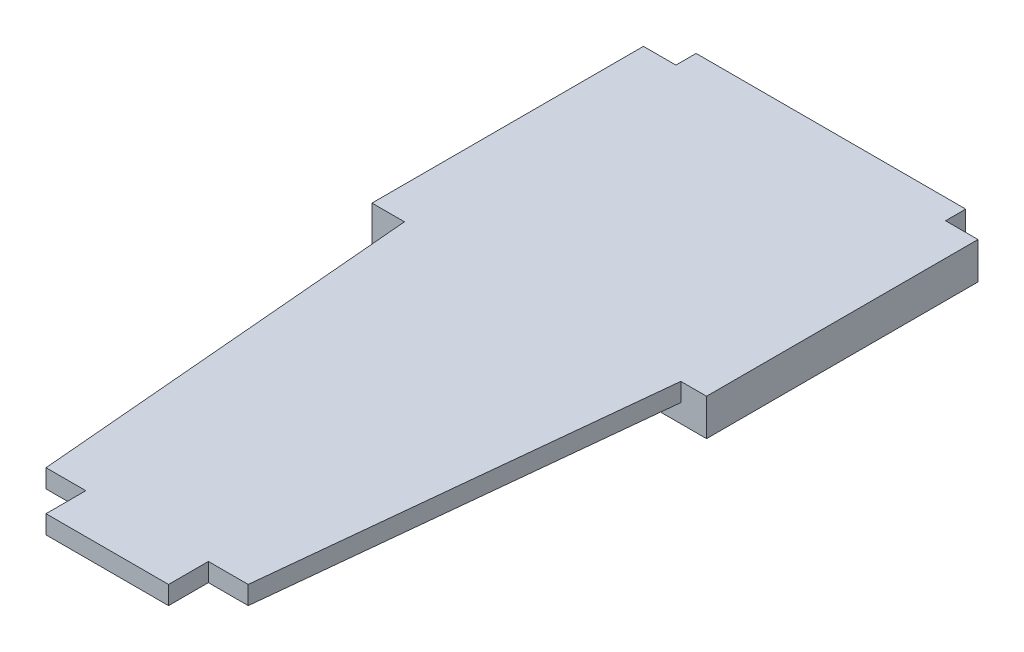
ISO-10303-21;
HEADER;
FILE_DESCRIPTION(('STEP AP214'),'2;1');
FILE_NAME('part.step','',(''),(''),'','','');
FILE_SCHEMA(('AUTOMOTIVE_DESIGN { 1 0 10303 214 1 1 1 1 }'));
ENDSEC;
DATA;
#1=APPLICATION_CONTEXT('core data for automotive mechanical design processes');
#2=APPLICATION_PROTOCOL_DEFINITION('international standard','automotive_design',2000,#1);
#3=PRODUCT_CONTEXT('',#1,'mechanical');
#4=PRODUCT('Part','Part','',(#3));
#5=PRODUCT_RELATED_PRODUCT_CATEGORY('part','',(#4));
#6=PRODUCT_DEFINITION_FORMATION('','',#4);
#7=PRODUCT_DEFINITION_CONTEXT('part definition',#1,'design');
#8=PRODUCT_DEFINITION('design','',#6,#7);
#9=PRODUCT_DEFINITION_SHAPE('','',#8);
#10=(LENGTH_UNIT() NAMED_UNIT(*) SI_UNIT(.MILLI.,.METRE.));
#11=(NAMED_UNIT(*) PLANE_ANGLE_UNIT() SI_UNIT($,.RADIAN.));
#12=(NAMED_UNIT(*) SI_UNIT($,.STERADIAN.) SOLID_ANGLE_UNIT());
#13=UNCERTAINTY_MEASURE_WITH_UNIT(LENGTH_MEASURE(1.E-05),#10,'distance_accuracy_value','');
#14=(GEOMETRIC_REPRESENTATION_CONTEXT(3) GLOBAL_UNCERTAINTY_ASSIGNED_CONTEXT((#13)) GLOBAL_UNIT_ASSIGNED_CONTEXT((#10,
#11,#12)) REPRESENTATION_CONTEXT('',''));
#15=CARTESIAN_POINT('',(0.,0.,0.));
#16=DIRECTION('',(0.,0.,1.));
#17=DIRECTION('',(1.,0.,0.));
#18=AXIS2_PLACEMENT_3D('',#15,#16,#17);
#19=CARTESIAN_POINT('',(22.,3.,0.));
#20=DIRECTION('',(1.,0.,0.));
#21=DIRECTION('',(0.,0.,-1.));
#22=AXIS2_PLACEMENT_3D('',#19,#20,#21);
#23=PLANE('',#22);
#24=DIRECTION('',(0.,-1.,0.));
#25=VECTOR('',#24,1.);
#26=CARTESIAN_POINT('',(22.,3.,-108.3));
#27=LINE('',#26,#25);
#28=CARTESIAN_POINT('',(22.,3.,-108.3));
#29=VERTEX_POINT('',#28);
#30=CARTESIAN_POINT('',(22.,-3.,-108.3));
#31=VERTEX_POINT('',#30);
#32=EDGE_CURVE('E60',#29,#31,#27,.T.);
#33=ORIENTED_EDGE('',*,*,#32,.T.);
#34=DIRECTION('',(0.,0.,1.));
#35=VECTOR('',#34,1.);
#36=CARTESIAN_POINT('',(22.,-3.,0.));
#37=LINE('',#36,#35);
#38=CARTESIAN_POINT('',(22.,-3.,-111.6));
#39=VERTEX_POINT('',#38);
#40=EDGE_CURVE('E243',#39,#31,#37,.T.);
#41=ORIENTED_EDGE('',*,*,#40,.F.);
#42=DIRECTION('',(0.,-1.,0.));
#43=VECTOR('',#42,1.);
#44=CARTESIAN_POINT('',(22.,3.,-111.6));
#45=LINE('',#44,#43);
#46=CARTESIAN_POINT('',(22.,3.,-111.6));
#47=VERTEX_POINT('',#46);
#48=EDGE_CURVE('E46',#47,#39,#45,.T.);
#49=ORIENTED_EDGE('',*,*,#48,.F.);
#50=DIRECTION('',(0.,0.,1.));
#51=VECTOR('',#50,1.);
#52=CARTESIAN_POINT('',(22.,3.,0.));
#53=LINE('',#52,#51);
#54=EDGE_CURVE('E193',#47,#29,#53,.T.);
#55=ORIENTED_EDGE('',*,*,#54,.T.);
#56=EDGE_LOOP('',(#33,#41,#49,#55));
#57=FACE_BOUND('',#56,.T.);
#58=ADVANCED_FACE('F43',(#57),#23,.T.);
#59=CARTESIAN_POINT('',(0.,3.,-111.6));
#60=DIRECTION('',(0.,0.,-1.));
#61=DIRECTION('',(-1.,0.,0.));
#62=AXIS2_PLACEMENT_3D('',#59,#60,#61);
#63=PLANE('',#62);
#64=ORIENTED_EDGE('',*,*,#48,.T.);
#65=DIRECTION('',(1.,0.,0.));
#66=VECTOR('',#65,1.);
#67=CARTESIAN_POINT('',(0.,-3.,-111.6));
#68=LINE('',#67,#66);
#69=CARTESIAN_POINT('',(-22.,-3.,-111.6));
#70=VERTEX_POINT('',#69);
#71=EDGE_CURVE('E234',#70,#39,#68,.T.);
#72=ORIENTED_EDGE('',*,*,#71,.F.);
#73=DIRECTION('',(0.,-1.,0.));
#74=VECTOR('',#73,1.);
#75=CARTESIAN_POINT('',(-22.,3.,-111.6));
#76=LINE('',#75,#74);
#77=CARTESIAN_POINT('',(-22.,3.,-111.6));
#78=VERTEX_POINT('',#77);
#79=EDGE_CURVE('E221',#78,#70,#76,.T.);
#80=ORIENTED_EDGE('',*,*,#79,.F.);
#81=DIRECTION('',(1.,0.,0.));
#82=VECTOR('',#81,1.);
#83=CARTESIAN_POINT('',(0.,3.,-111.6));
#84=LINE('',#83,#82);
#85=EDGE_CURVE('E236',#78,#47,#84,.T.);
#86=ORIENTED_EDGE('',*,*,#85,.T.);
#87=EDGE_LOOP('',(#64,#72,#80,#86));
#88=FACE_BOUND('',#87,.T.);
#89=ADVANCED_FACE('F233',(#88),#63,.T.);
#90=CARTESIAN_POINT('',(-22.,3.,0.));
#91=DIRECTION('',(1.,0.,0.));
#92=DIRECTION('',(0.,0.,-1.));
#93=AXIS2_PLACEMENT_3D('',#90,#91,#92);
#94=PLANE('',#93);
#95=ORIENTED_EDGE('',*,*,#79,.T.);
#96=DIRECTION('',(0.,0.,-1.));
#97=VECTOR('',#96,1.);
#98=CARTESIAN_POINT('',(-22.,-3.,0.));
#99=LINE('',#98,#97);
#100=CARTESIAN_POINT('',(-22.,-3.,-108.3));
#101=VERTEX_POINT('',#100);
#102=EDGE_CURVE('E245',#101,#70,#99,.T.);
#103=ORIENTED_EDGE('',*,*,#102,.F.);
#104=DIRECTION('',(0.,-1.,0.));
#105=VECTOR('',#104,1.);
#106=CARTESIAN_POINT('',(-22.,3.,-108.3));
#107=LINE('',#106,#105);
#108=CARTESIAN_POINT('',(-22.,3.,-108.3));
#109=VERTEX_POINT('',#108);
#110=EDGE_CURVE('E219',#109,#101,#107,.T.);
#111=ORIENTED_EDGE('',*,*,#110,.F.);
#112=DIRECTION('',(0.,0.,1.));
#113=VECTOR('',#112,1.);
#114=CARTESIAN_POINT('',(-22.,3.,0.));
#115=LINE('',#114,#113);
#116=EDGE_CURVE('E255',#78,#109,#115,.T.);
#117=ORIENTED_EDGE('',*,*,#116,.F.);
#118=EDGE_LOOP('',(#95,#103,#111,#117));
#119=FACE_BOUND('',#118,.T.);
#120=ADVANCED_FACE('F307',(#119),#94,.F.);
#121=CARTESIAN_POINT('',(0.,3.,-108.3));
#122=DIRECTION('',(0.,0.,-1.));
#123=DIRECTION('',(-1.,0.,0.));
#124=AXIS2_PLACEMENT_3D('',#121,#122,#123);
#125=PLANE('',#124);
#126=ORIENTED_EDGE('',*,*,#110,.T.);
#127=DIRECTION('',(1.,0.,0.));
#128=VECTOR('',#127,1.);
#129=CARTESIAN_POINT('',(0.,-3.,-108.3));
#130=LINE('',#129,#128);
#131=CARTESIAN_POINT('',(-27.3,-3.,-108.3));
#132=VERTEX_POINT('',#131);
#133=EDGE_CURVE('E301',#132,#101,#130,.T.);
#134=ORIENTED_EDGE('',*,*,#133,.F.);
#135=DIRECTION('',(0.,-1.,0.));
#136=VECTOR('',#135,1.);
#137=CARTESIAN_POINT('',(-27.3,3.,-108.3));
#138=LINE('',#137,#136);
#139=CARTESIAN_POINT('',(-27.3,3.,-108.3));
#140=VERTEX_POINT('',#139);
#141=EDGE_CURVE('E216',#140,#132,#138,.T.);
#142=ORIENTED_EDGE('',*,*,#141,.F.);
#143=DIRECTION('',(1.,0.,0.));
#144=VECTOR('',#143,1.);
#145=CARTESIAN_POINT('',(0.,3.,-108.3));
#146=LINE('',#145,#144);
#147=EDGE_CURVE('E174',#140,#109,#146,.T.);
#148=ORIENTED_EDGE('',*,*,#147,.T.);
#149=EDGE_LOOP('',(#126,#134,#142,#148));
#150=FACE_BOUND('',#149,.T.);
#151=ADVANCED_FACE('F309',(#150),#125,.T.);
#152=CARTESIAN_POINT('',(-27.3,3.,0.));
#153=DIRECTION('',(-1.,0.,0.));
#154=DIRECTION('',(0.,0.,1.));
#155=AXIS2_PLACEMENT_3D('',#152,#153,#154);
#156=PLANE('',#155);
#157=ORIENTED_EDGE('',*,*,#141,.T.);
#158=DIRECTION('',(0.,0.,-1.));
#159=VECTOR('',#158,1.);
#160=CARTESIAN_POINT('',(-27.3,-3.,0.));
#161=LINE('',#160,#159);
#162=CARTESIAN_POINT('',(-27.3,-3.,-64.));
#163=VERTEX_POINT('',#162);
#164=EDGE_CURVE('E298',#163,#132,#161,.T.);
#165=ORIENTED_EDGE('',*,*,#164,.F.);
#166=DIRECTION('',(0.,-1.,0.));
#167=VECTOR('',#166,1.);
#168=CARTESIAN_POINT('',(-27.3,3.,-64.));
#169=LINE('',#168,#167);
#170=CARTESIAN_POINT('',(-27.3,3.,-64.));
#171=VERTEX_POINT('',#170);
#172=EDGE_CURVE('E214',#171,#163,#169,.T.);
#173=ORIENTED_EDGE('',*,*,#172,.F.);
#174=DIRECTION('',(0.,0.,-1.));
#175=VECTOR('',#174,1.);
#176=CARTESIAN_POINT('',(-27.3,3.,0.));
#177=LINE('',#176,#175);
#178=EDGE_CURVE('E258',#171,#140,#177,.T.);
#179=ORIENTED_EDGE('',*,*,#178,.T.);
#180=EDGE_LOOP('',(#157,#165,#173,#179));
#181=FACE_BOUND('',#180,.T.);
#182=ADVANCED_FACE('F299',(#181),#156,.T.);
#183=CARTESIAN_POINT('',(-16.3790366555589,3.,1.40757346258709));
#184=DIRECTION('',(-0.996327701218676,0.,0.08562191182348));
#185=DIRECTION('',(0.08562191182348,0.,0.996327701218677));
#186=AXIS2_PLACEMENT_3D('',#183,#184,#185);
#187=PLANE('',#186);
#188=DIRECTION('',(-0.08562191182348,0.,-0.996327701218677));
#189=VECTOR('',#188,1.);
#190=CARTESIAN_POINT('',(-16.3790366555589,0.,1.40757346258709));
#191=LINE('',#190,#189);
#192=CARTESIAN_POINT('',(-16.5,0.,0.));
#193=VERTEX_POINT('',#192);
#194=CARTESIAN_POINT('',(-22.,0.,-64.));
#195=VERTEX_POINT('',#194);
#196=EDGE_CURVE('E178',#193,#195,#191,.T.);
#197=ORIENTED_EDGE('',*,*,#196,.F.);
#198=DIRECTION('',(0.,-1.,0.));
#199=VECTOR('',#198,1.);
#200=CARTESIAN_POINT('',(-16.5,3.,0.));
#201=LINE('',#200,#199);
#202=CARTESIAN_POINT('',(-16.5,3.,0.));
#203=VERTEX_POINT('',#202);
#204=EDGE_CURVE('E209',#203,#193,#201,.T.);
#205=ORIENTED_EDGE('',*,*,#204,.F.);
#206=DIRECTION('',(-0.08562191182348,0.,-0.996327701218677));
#207=VECTOR('',#206,1.);
#208=CARTESIAN_POINT('',(-16.3790366555589,3.,1.40757346258709));
#209=LINE('',#208,#207);
#210=CARTESIAN_POINT('',(-22.,3.,-64.));
#211=VERTEX_POINT('',#210);
#212=EDGE_CURVE('E261',#203,#211,#209,.T.);
#213=ORIENTED_EDGE('',*,*,#212,.T.);
#214=DIRECTION('',(0.,-1.,0.));
#215=VECTOR('',#214,1.);
#216=CARTESIAN_POINT('',(-22.,3.,-64.));
#217=LINE('',#216,#215);
#218=EDGE_CURVE('E211',#211,#195,#217,.T.);
#219=ORIENTED_EDGE('',*,*,#218,.T.);
#220=EDGE_LOOP('',(#197,#205,#213,#219));
#221=FACE_BOUND('',#220,.T.);
#222=ADVANCED_FACE('F334',(#221),#187,.T.);
#223=CARTESIAN_POINT('',(0.,3.,0.));
#224=DIRECTION('',(0.,0.,-1.));
#225=DIRECTION('',(-1.,0.,0.));
#226=AXIS2_PLACEMENT_3D('',#223,#224,#225);
#227=PLANE('',#226);
#228=DIRECTION('',(1.,0.,0.));
#229=VECTOR('',#228,1.);
#230=CARTESIAN_POINT('',(0.,0.,0.));
#231=LINE('',#230,#229);
#232=CARTESIAN_POINT('',(-10.,0.,0.));
#233=VERTEX_POINT('',#232);
#234=EDGE_CURVE('E181',#193,#233,#231,.T.);
#235=ORIENTED_EDGE('',*,*,#234,.T.);
#236=DIRECTION('',(0.,-1.,0.));
#237=VECTOR('',#236,1.);
#238=CARTESIAN_POINT('',(-10.,3.,0.));
#239=LINE('',#238,#237);
#240=CARTESIAN_POINT('',(-10.,3.,0.));
#241=VERTEX_POINT('',#240);
#242=EDGE_CURVE('E206',#241,#233,#239,.T.);
#243=ORIENTED_EDGE('',*,*,#242,.F.);
#244=DIRECTION('',(1.,0.,0.));
#245=VECTOR('',#244,1.);
#246=CARTESIAN_POINT('',(0.,3.,0.));
#247=LINE('',#246,#245);
#248=EDGE_CURVE('E264',#203,#241,#247,.T.);
#249=ORIENTED_EDGE('',*,*,#248,.F.);
#250=ORIENTED_EDGE('',*,*,#204,.T.);
#251=EDGE_LOOP('',(#235,#243,#249,#250));
#252=FACE_BOUND('',#251,.T.);
#253=ADVANCED_FACE('F337',(#252),#227,.F.);
#254=CARTESIAN_POINT('',(-10.,3.,0.));
#255=DIRECTION('',(1.,0.,0.));
#256=DIRECTION('',(0.,0.,-1.));
#257=AXIS2_PLACEMENT_3D('',#254,#255,#256);
#258=PLANE('',#257);
#259=DIRECTION('',(0.,0.,1.));
#260=VECTOR('',#259,1.);
#261=CARTESIAN_POINT('',(-10.,0.,0.));
#262=LINE('',#261,#260);
#263=CARTESIAN_POINT('',(-10.,0.,6.5));
#264=VERTEX_POINT('',#263);
#265=EDGE_CURVE('E184',#233,#264,#262,.T.);
#266=ORIENTED_EDGE('',*,*,#265,.T.);
#267=DIRECTION('',(0.,-1.,0.));
#268=VECTOR('',#267,1.);
#269=CARTESIAN_POINT('',(-10.,3.,6.5));
#270=LINE('',#269,#268);
#271=CARTESIAN_POINT('',(-10.,3.,6.5));
#272=VERTEX_POINT('',#271);
#273=EDGE_CURVE('E203',#272,#264,#270,.T.);
#274=ORIENTED_EDGE('',*,*,#273,.F.);
#275=DIRECTION('',(0.,0.,1.));
#276=VECTOR('',#275,1.);
#277=CARTESIAN_POINT('',(-10.,3.,0.));
#278=LINE('',#277,#276);
#279=EDGE_CURVE('E266',#241,#272,#278,.T.);
#280=ORIENTED_EDGE('',*,*,#279,.F.);
#281=ORIENTED_EDGE('',*,*,#242,.T.);
#282=EDGE_LOOP('',(#266,#274,#280,#281));
#283=FACE_BOUND('',#282,.T.);
#284=ADVANCED_FACE('F341',(#283),#258,.F.);
#285=CARTESIAN_POINT('',(0.,3.,6.5));
#286=DIRECTION('',(0.,0.,-1.));
#287=DIRECTION('',(-1.,0.,0.));
#288=AXIS2_PLACEMENT_3D('',#285,#286,#287);
#289=PLANE('',#288);
#290=DIRECTION('',(1.,0.,0.));
#291=VECTOR('',#290,1.);
#292=CARTESIAN_POINT('',(0.,0.,6.5));
#293=LINE('',#292,#291);
#294=CARTESIAN_POINT('',(10.,0.,6.5));
#295=VERTEX_POINT('',#294);
#296=EDGE_CURVE('E186',#264,#295,#293,.T.);
#297=ORIENTED_EDGE('',*,*,#296,.T.);
#298=DIRECTION('',(0.,-1.,0.));
#299=VECTOR('',#298,1.);
#300=CARTESIAN_POINT('',(10.,3.,6.5));
#301=LINE('',#300,#299);
#302=CARTESIAN_POINT('',(10.,3.,6.5));
#303=VERTEX_POINT('',#302);
#304=EDGE_CURVE('E201',#303,#295,#301,.T.);
#305=ORIENTED_EDGE('',*,*,#304,.F.);
#306=DIRECTION('',(1.,0.,0.));
#307=VECTOR('',#306,1.);
#308=CARTESIAN_POINT('',(0.,3.,6.5));
#309=LINE('',#308,#307);
#310=EDGE_CURVE('E268',#272,#303,#309,.T.);
#311=ORIENTED_EDGE('',*,*,#310,.F.);
#312=ORIENTED_EDGE('',*,*,#273,.T.);
#313=EDGE_LOOP('',(#297,#305,#311,#312));
#314=FACE_BOUND('',#313,.T.);
#315=ADVANCED_FACE('F345',(#314),#289,.F.);
#316=CARTESIAN_POINT('',(10.,3.,0.));
#317=DIRECTION('',(-1.,0.,0.));
#318=DIRECTION('',(0.,0.,1.));
#319=AXIS2_PLACEMENT_3D('',#316,#317,#318);
#320=PLANE('',#319);
#321=DIRECTION('',(0.,0.,-1.));
#322=VECTOR('',#321,1.);
#323=CARTESIAN_POINT('',(10.,0.,0.));
#324=LINE('',#323,#322);
#325=CARTESIAN_POINT('',(10.,0.,0.));
#326=VERTEX_POINT('',#325);
#327=EDGE_CURVE('E85',#295,#326,#324,.T.);
#328=ORIENTED_EDGE('',*,*,#327,.T.);
#329=DIRECTION('',(0.,-1.,0.));
#330=VECTOR('',#329,1.);
#331=CARTESIAN_POINT('',(10.,3.,0.));
#332=LINE('',#331,#330);
#333=CARTESIAN_POINT('',(10.,3.,0.));
#334=VERTEX_POINT('',#333);
#335=EDGE_CURVE('E199',#334,#326,#332,.T.);
#336=ORIENTED_EDGE('',*,*,#335,.F.);
#337=DIRECTION('',(0.,0.,-1.));
#338=VECTOR('',#337,1.);
#339=CARTESIAN_POINT('',(10.,3.,0.));
#340=LINE('',#339,#338);
#341=EDGE_CURVE('E270',#303,#334,#340,.T.);
#342=ORIENTED_EDGE('',*,*,#341,.F.);
#343=ORIENTED_EDGE('',*,*,#304,.T.);
#344=EDGE_LOOP('',(#328,#336,#342,#343));
#345=FACE_BOUND('',#344,.T.);
#346=ADVANCED_FACE('F349',(#345),#320,.F.);
#347=CARTESIAN_POINT('',(0.,3.,0.));
#348=DIRECTION('',(0.,0.,-1.));
#349=DIRECTION('',(-1.,0.,0.));
#350=AXIS2_PLACEMENT_3D('',#347,#348,#349);
#351=PLANE('',#350);
#352=DIRECTION('',(1.,0.,0.));
#353=VECTOR('',#352,1.);
#354=CARTESIAN_POINT('',(0.,0.,0.));
#355=LINE('',#354,#353);
#356=CARTESIAN_POINT('',(16.5,0.,0.));
#357=VERTEX_POINT('',#356);
#358=EDGE_CURVE('E92',#326,#357,#355,.T.);
#359=ORIENTED_EDGE('',*,*,#358,.T.);
#360=DIRECTION('',(0.,-1.,0.));
#361=VECTOR('',#360,1.);
#362=CARTESIAN_POINT('',(16.5,3.,0.));
#363=LINE('',#362,#361);
#364=CARTESIAN_POINT('',(16.5,3.,0.));
#365=VERTEX_POINT('',#364);
#366=EDGE_CURVE('E197',#365,#357,#363,.T.);
#367=ORIENTED_EDGE('',*,*,#366,.F.);
#368=DIRECTION('',(1.,0.,0.));
#369=VECTOR('',#368,1.);
#370=CARTESIAN_POINT('',(0.,3.,0.));
#371=LINE('',#370,#369);
#372=EDGE_CURVE('E271',#334,#365,#371,.T.);
#373=ORIENTED_EDGE('',*,*,#372,.F.);
#374=ORIENTED_EDGE('',*,*,#335,.T.);
#375=EDGE_LOOP('',(#359,#367,#373,#374));
#376=FACE_BOUND('',#375,.T.);
#377=ADVANCED_FACE('F274',(#376),#351,.F.);
#378=CARTESIAN_POINT('',(16.3263728512209,3.,1.68365720028216));
#379=DIRECTION('',(-0.994724656625258,0.,-0.10258098021448));
#380=DIRECTION('',(-0.10258098021448,0.,0.994724656625258));
#381=AXIS2_PLACEMENT_3D('',#378,#379,#380);
#382=PLANE('',#381);
#383=DIRECTION('',(0.10258098021448,0.,-0.994724656625258));
#384=VECTOR('',#383,1.);
#385=CARTESIAN_POINT('',(16.3263728512209,0.,1.68365720028216));
#386=LINE('',#385,#384);
#387=CARTESIAN_POINT('',(23.1,0.,-64.));
#388=VERTEX_POINT('',#387);
#389=EDGE_CURVE('E190',#357,#388,#386,.T.);
#390=ORIENTED_EDGE('',*,*,#389,.T.);
#391=DIRECTION('',(0.,-1.,0.));
#392=VECTOR('',#391,1.);
#393=CARTESIAN_POINT('',(23.1,3.,-64.));
#394=LINE('',#393,#392);
#395=CARTESIAN_POINT('',(23.1,3.,-64.));
#396=VERTEX_POINT('',#395);
#397=EDGE_CURVE('E166',#396,#388,#394,.T.);
#398=ORIENTED_EDGE('',*,*,#397,.F.);
#399=DIRECTION('',(0.10258098021448,0.,-0.994724656625258));
#400=VECTOR('',#399,1.);
#401=CARTESIAN_POINT('',(16.3263728512209,3.,1.68365720028216));
#402=LINE('',#401,#400);
#403=EDGE_CURVE('E149',#365,#396,#402,.T.);
#404=ORIENTED_EDGE('',*,*,#403,.F.);
#405=ORIENTED_EDGE('',*,*,#366,.T.);
#406=EDGE_LOOP('',(#390,#398,#404,#405));
#407=FACE_BOUND('',#406,.T.);
#408=ADVANCED_FACE('F277',(#407),#382,.F.);
#409=CARTESIAN_POINT('',(0.,3.,-64.));
#410=DIRECTION('',(0.,0.,-1.));
#411=DIRECTION('',(-1.,0.,0.));
#412=AXIS2_PLACEMENT_3D('',#409,#410,#411);
#413=PLANE('',#412);
#414=ORIENTED_EDGE('',*,*,#397,.T.);
#415=DIRECTION('',(1.,0.,0.));
#416=VECTOR('',#415,1.);
#417=CARTESIAN_POINT('',(0.,0.,-64.));
#418=LINE('',#417,#416);
#419=EDGE_CURVE('E11',#195,#388,#418,.T.);
#420=ORIENTED_EDGE('',*,*,#419,.F.);
#421=ORIENTED_EDGE('',*,*,#218,.F.);
#422=DIRECTION('',(1.,0.,0.));
#423=VECTOR('',#422,1.);
#424=CARTESIAN_POINT('',(0.,3.,-64.));
#425=LINE('',#424,#423);
#426=EDGE_CURVE('E154',#171,#211,#425,.T.);
#427=ORIENTED_EDGE('',*,*,#426,.F.);
#428=ORIENTED_EDGE('',*,*,#172,.T.);
#429=DIRECTION('',(1.,0.,0.));
#430=VECTOR('',#429,1.);
#431=CARTESIAN_POINT('',(0.,-3.,-64.));
#432=LINE('',#431,#430);
#433=CARTESIAN_POINT('',(27.3,-3.,-64.));
#434=VERTEX_POINT('',#433);
#435=EDGE_CURVE('E162',#163,#434,#432,.T.);
#436=ORIENTED_EDGE('',*,*,#435,.T.);
#437=DIRECTION('',(0.,-1.,0.));
#438=VECTOR('',#437,1.);
#439=CARTESIAN_POINT('',(27.3,3.,-64.));
#440=LINE('',#439,#438);
#441=CARTESIAN_POINT('',(27.3,3.,-64.));
#442=VERTEX_POINT('',#441);
#443=EDGE_CURVE('E157',#442,#434,#440,.T.);
#444=ORIENTED_EDGE('',*,*,#443,.F.);
#445=EDGE_CURVE('E141',#396,#442,#425,.T.);
#446=ORIENTED_EDGE('',*,*,#445,.F.);
#447=EDGE_LOOP('',(#414,#420,#421,#427,#428,#436,#444,#446));
#448=FACE_BOUND('',#447,.T.);
#449=ADVANCED_FACE('F158',(#448),#413,.F.);
#450=CARTESIAN_POINT('',(27.3,3.,0.));
#451=DIRECTION('',(-1.,0.,0.));
#452=DIRECTION('',(0.,0.,1.));
#453=AXIS2_PLACEMENT_3D('',#450,#451,#452);
#454=PLANE('',#453);
#455=ORIENTED_EDGE('',*,*,#443,.T.);
#456=DIRECTION('',(0.,0.,1.));
#457=VECTOR('',#456,1.);
#458=CARTESIAN_POINT('',(27.3,-3.,0.));
#459=LINE('',#458,#457);
#460=CARTESIAN_POINT('',(27.3,-3.,-108.3));
#461=VERTEX_POINT('',#460);
#462=EDGE_CURVE('E182',#461,#434,#459,.T.);
#463=ORIENTED_EDGE('',*,*,#462,.F.);
#464=DIRECTION('',(0.,-1.,0.));
#465=VECTOR('',#464,1.);
#466=CARTESIAN_POINT('',(27.3,3.,-108.3));
#467=LINE('',#466,#465);
#468=CARTESIAN_POINT('',(27.3,3.,-108.3));
#469=VERTEX_POINT('',#468);
#470=EDGE_CURVE('E167',#469,#461,#467,.T.);
#471=ORIENTED_EDGE('',*,*,#470,.F.);
#472=DIRECTION('',(0.,0.,-1.));
#473=VECTOR('',#472,1.);
#474=CARTESIAN_POINT('',(27.3,3.,0.));
#475=LINE('',#474,#473);
#476=EDGE_CURVE('E146',#442,#469,#475,.T.);
#477=ORIENTED_EDGE('',*,*,#476,.F.);
#478=EDGE_LOOP('',(#455,#463,#471,#477));
#479=FACE_BOUND('',#478,.T.);
#480=ADVANCED_FACE('F169',(#479),#454,.F.);
#481=ORIENTED_EDGE('',*,*,#470,.T.);
#482=DIRECTION('',(1.,0.,0.));
#483=VECTOR('',#482,1.);
#484=CARTESIAN_POINT('',(0.,-3.,-108.3));
#485=LINE('',#484,#483);
#486=EDGE_CURVE('E247',#31,#461,#485,.T.);
#487=ORIENTED_EDGE('',*,*,#486,.F.);
#488=ORIENTED_EDGE('',*,*,#32,.F.);
#489=EDGE_CURVE('E171',#29,#469,#146,.T.);
#490=ORIENTED_EDGE('',*,*,#489,.T.);
#491=EDGE_LOOP('',(#481,#487,#488,#490));
#492=FACE_BOUND('',#491,.T.);
#493=ADVANCED_FACE('F310',(#492),#125,.T.);
#494=CARTESIAN_POINT('',(0.,3.,0.));
#495=DIRECTION('',(0.,1.,0.));
#496=DIRECTION('',(0.,0.,1.));
#497=AXIS2_PLACEMENT_3D('',#494,#495,#496);
#498=PLANE('',#497);
#499=ORIENTED_EDGE('',*,*,#54,.F.);
#500=ORIENTED_EDGE('',*,*,#85,.F.);
#501=ORIENTED_EDGE('',*,*,#116,.T.);
#502=ORIENTED_EDGE('',*,*,#147,.F.);
#503=ORIENTED_EDGE('',*,*,#178,.F.);
#504=ORIENTED_EDGE('',*,*,#426,.T.);
#505=ORIENTED_EDGE('',*,*,#212,.F.);
#506=ORIENTED_EDGE('',*,*,#248,.T.);
#507=ORIENTED_EDGE('',*,*,#279,.T.);
#508=ORIENTED_EDGE('',*,*,#310,.T.);
#509=ORIENTED_EDGE('',*,*,#341,.T.);
#510=ORIENTED_EDGE('',*,*,#372,.T.);
#511=ORIENTED_EDGE('',*,*,#403,.T.);
#512=ORIENTED_EDGE('',*,*,#445,.T.);
#513=ORIENTED_EDGE('',*,*,#476,.T.);
#514=ORIENTED_EDGE('',*,*,#489,.F.);
#515=EDGE_LOOP('',(#499,#500,#501,#502,#503,#504,#505,#506,#507,#508,#509,#510,#511,#512,#513,#514));
#516=FACE_BOUND('',#515,.T.);
#517=ADVANCED_FACE('F143',(#516),#498,.T.);
#518=CARTESIAN_POINT('',(0.,0.,0.));
#519=DIRECTION('',(0.,1.,0.));
#520=DIRECTION('',(0.,0.,1.));
#521=AXIS2_PLACEMENT_3D('',#518,#519,#520);
#522=PLANE('',#521);
#523=ORIENTED_EDGE('',*,*,#196,.T.);
#524=ORIENTED_EDGE('',*,*,#419,.T.);
#525=ORIENTED_EDGE('',*,*,#389,.F.);
#526=ORIENTED_EDGE('',*,*,#358,.F.);
#527=ORIENTED_EDGE('',*,*,#327,.F.);
#528=ORIENTED_EDGE('',*,*,#296,.F.);
#529=ORIENTED_EDGE('',*,*,#265,.F.);
#530=ORIENTED_EDGE('',*,*,#234,.F.);
#531=EDGE_LOOP('',(#523,#524,#525,#526,#527,#528,#529,#530));
#532=FACE_BOUND('',#531,.T.);
#533=ADVANCED_FACE('F318',(#532),#522,.F.);
#534=CARTESIAN_POINT('',(0.,-3.,0.));
#535=DIRECTION('',(0.,-1.,0.));
#536=DIRECTION('',(0.,0.,-1.));
#537=AXIS2_PLACEMENT_3D('',#534,#535,#536);
#538=PLANE('',#537);
#539=ORIENTED_EDGE('',*,*,#435,.F.);
#540=ORIENTED_EDGE('',*,*,#164,.T.);
#541=ORIENTED_EDGE('',*,*,#133,.T.);
#542=ORIENTED_EDGE('',*,*,#102,.T.);
#543=ORIENTED_EDGE('',*,*,#71,.T.);
#544=ORIENTED_EDGE('',*,*,#40,.T.);
#545=ORIENTED_EDGE('',*,*,#486,.T.);
#546=ORIENTED_EDGE('',*,*,#462,.T.);
#547=EDGE_LOOP('',(#539,#540,#541,#542,#543,#544,#545,#546));
#548=FACE_BOUND('',#547,.T.);
#549=ADVANCED_FACE('F241',(#548),#538,.T.);
#550=CLOSED_SHELL('',(#58,#89,#120,#151,#182,#222,#253,#284,#315,#346,#377,#408,#449,#480,#493,
#517,#533,#549));
#551=MANIFOLD_SOLID_BREP('B2',#550);
#552=ADVANCED_BREP_SHAPE_REPRESENTATION('',(#18,#551),#14);
#553=SHAPE_DEFINITION_REPRESENTATION(#9,#552);
ENDSEC;
END-ISO-10303-21;
